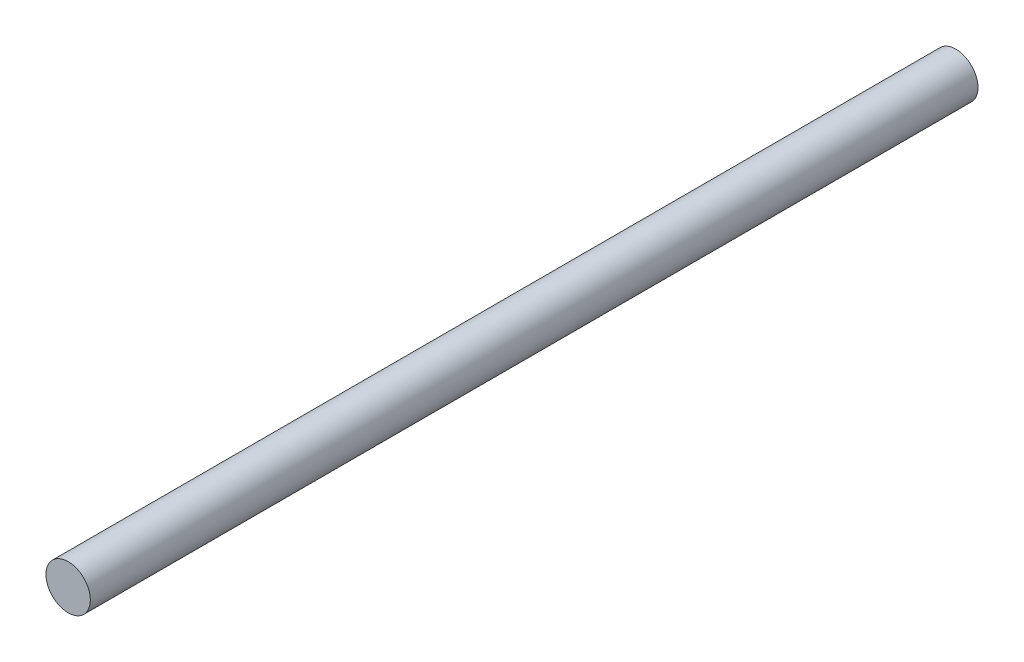
ISO-10303-21;
HEADER;
FILE_DESCRIPTION(('STEP AP214'),'2;1');
FILE_NAME('part.step','',(''),(''),'','','');
FILE_SCHEMA(('AUTOMOTIVE_DESIGN { 1 0 10303 214 1 1 1 1 }'));
ENDSEC;
DATA;
#1=APPLICATION_CONTEXT('core data for automotive mechanical design processes');
#2=APPLICATION_PROTOCOL_DEFINITION('international standard','automotive_design',2000,#1);
#3=PRODUCT_CONTEXT('',#1,'mechanical');
#4=PRODUCT('Part','Part','',(#3));
#5=PRODUCT_RELATED_PRODUCT_CATEGORY('part','',(#4));
#6=PRODUCT_DEFINITION_FORMATION('','',#4);
#7=PRODUCT_DEFINITION_CONTEXT('part definition',#1,'design');
#8=PRODUCT_DEFINITION('design','',#6,#7);
#9=PRODUCT_DEFINITION_SHAPE('','',#8);
#10=(LENGTH_UNIT() NAMED_UNIT(*) SI_UNIT(.MILLI.,.METRE.));
#11=(NAMED_UNIT(*) PLANE_ANGLE_UNIT() SI_UNIT($,.RADIAN.));
#12=(NAMED_UNIT(*) SI_UNIT($,.STERADIAN.) SOLID_ANGLE_UNIT());
#13=UNCERTAINTY_MEASURE_WITH_UNIT(LENGTH_MEASURE(1.E-05),#10,'distance_accuracy_value','');
#14=(GEOMETRIC_REPRESENTATION_CONTEXT(3) GLOBAL_UNCERTAINTY_ASSIGNED_CONTEXT((#13)) GLOBAL_UNIT_ASSIGNED_CONTEXT((#10,
#11,#12)) REPRESENTATION_CONTEXT('',''));
#15=CARTESIAN_POINT('',(0.,0.,0.));
#16=DIRECTION('',(0.,0.,1.));
#17=DIRECTION('',(1.,0.,0.));
#18=AXIS2_PLACEMENT_3D('',#15,#16,#17);
#19=CARTESIAN_POINT('',(0.,0.,127.));
#20=DIRECTION('',(0.,0.,-1.));
#21=DIRECTION('',(-1.,0.,0.));
#22=AXIS2_PLACEMENT_3D('',#19,#20,#21);
#23=CYLINDRICAL_SURFACE('',#22,6.35);
#24=CARTESIAN_POINT('',(0.,0.,127.));
#25=DIRECTION('',(0.,0.,1.));
#26=DIRECTION('',(1.,0.,0.));
#27=AXIS2_PLACEMENT_3D('',#24,#25,#26);
#28=CIRCLE('',#27,6.35);
#29=CARTESIAN_POINT('',(6.35,0.,127.));
#30=VERTEX_POINT('',#29);
#31=EDGE_CURVE('E10',#30,#30,#28,.T.);
#32=ORIENTED_EDGE('',*,*,#31,.F.);
#33=EDGE_LOOP('',(#32));
#34=FACE_BOUND('',#33,.T.);
#35=CARTESIAN_POINT('',(0.,0.,-127.));
#36=DIRECTION('',(0.,0.,1.));
#37=DIRECTION('',(1.,0.,0.));
#38=AXIS2_PLACEMENT_3D('',#35,#36,#37);
#39=CIRCLE('',#38,6.35);
#40=CARTESIAN_POINT('',(6.35,0.,-127.));
#41=VERTEX_POINT('',#40);
#42=EDGE_CURVE('E40',#41,#41,#39,.T.);
#43=ORIENTED_EDGE('',*,*,#42,.T.);
#44=EDGE_LOOP('',(#43));
#45=FACE_BOUND('',#44,.T.);
#46=ADVANCED_FACE('F37',(#34,#45),#23,.T.);
#47=CARTESIAN_POINT('',(0.,0.,127.));
#48=DIRECTION('',(0.,0.,1.));
#49=DIRECTION('',(1.,0.,0.));
#50=AXIS2_PLACEMENT_3D('',#47,#48,#49);
#51=PLANE('',#50);
#52=ORIENTED_EDGE('',*,*,#31,.T.);
#53=EDGE_LOOP('',(#52));
#54=FACE_BOUND('',#53,.T.);
#55=ADVANCED_FACE('F54',(#54),#51,.T.);
#56=CARTESIAN_POINT('',(0.,0.,-127.));
#57=DIRECTION('',(0.,0.,1.));
#58=DIRECTION('',(1.,0.,0.));
#59=AXIS2_PLACEMENT_3D('',#56,#57,#58);
#60=PLANE('',#59);
#61=ORIENTED_EDGE('',*,*,#42,.F.);
#62=EDGE_LOOP('',(#61));
#63=FACE_BOUND('',#62,.T.);
#64=ADVANCED_FACE('F52',(#63),#60,.F.);
#65=CLOSED_SHELL('',(#46,#55,#64));
#66=MANIFOLD_SOLID_BREP('B2',#65);
#67=ADVANCED_BREP_SHAPE_REPRESENTATION('',(#18,#66),#14);
#68=SHAPE_DEFINITION_REPRESENTATION(#9,#67);
ENDSEC;
END-ISO-10303-21;
